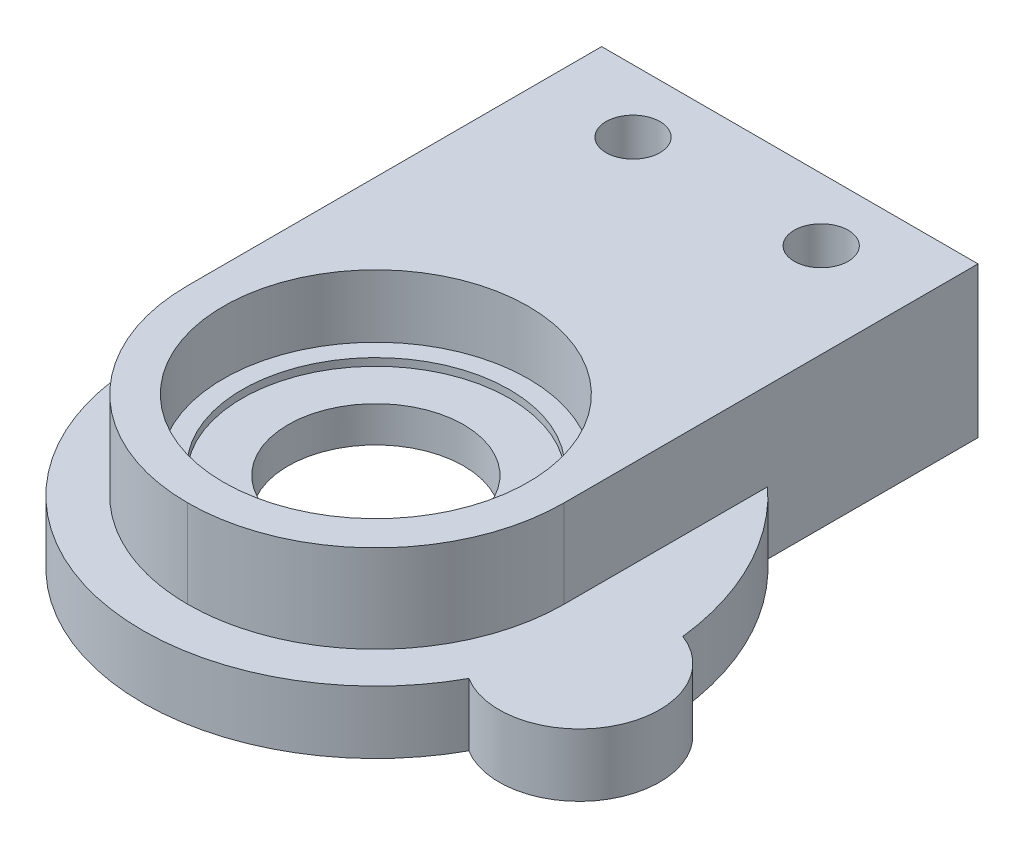
ISO-10303-21;
HEADER;
FILE_DESCRIPTION(('STEP AP214'),'2;1');
FILE_NAME('part.step','',(''),(''),'','','');
FILE_SCHEMA(('AUTOMOTIVE_DESIGN { 1 0 10303 214 1 1 1 1 }'));
ENDSEC;
DATA;
#1=APPLICATION_CONTEXT('core data for automotive mechanical design processes');
#2=APPLICATION_PROTOCOL_DEFINITION('international standard','automotive_design',2000,#1);
#3=PRODUCT_CONTEXT('',#1,'mechanical');
#4=PRODUCT('Part','Part','',(#3));
#5=PRODUCT_RELATED_PRODUCT_CATEGORY('part','',(#4));
#6=PRODUCT_DEFINITION_FORMATION('','',#4);
#7=PRODUCT_DEFINITION_CONTEXT('part definition',#1,'design');
#8=PRODUCT_DEFINITION('design','',#6,#7);
#9=PRODUCT_DEFINITION_SHAPE('','',#8);
#10=(LENGTH_UNIT() NAMED_UNIT(*) SI_UNIT(.MILLI.,.METRE.));
#11=(NAMED_UNIT(*) PLANE_ANGLE_UNIT() SI_UNIT($,.RADIAN.));
#12=(NAMED_UNIT(*) SI_UNIT($,.STERADIAN.) SOLID_ANGLE_UNIT());
#13=UNCERTAINTY_MEASURE_WITH_UNIT(LENGTH_MEASURE(1.E-05),#10,'distance_accuracy_value','');
#14=(GEOMETRIC_REPRESENTATION_CONTEXT(3) GLOBAL_UNCERTAINTY_ASSIGNED_CONTEXT((#13)) GLOBAL_UNIT_ASSIGNED_CONTEXT((#10,
#11,#12)) REPRESENTATION_CONTEXT('',''));
#15=CARTESIAN_POINT('',(0.,0.,0.));
#16=DIRECTION('',(0.,0.,1.));
#17=DIRECTION('',(1.,0.,0.));
#18=AXIS2_PLACEMENT_3D('',#15,#16,#17);
#19=CARTESIAN_POINT('',(15.,-1.,0.));
#20=DIRECTION('',(1.,0.,0.));
#21=DIRECTION('',(0.,0.,-1.));
#22=AXIS2_PLACEMENT_3D('',#19,#20,#21);
#23=PLANE('',#22);
#24=DIRECTION('',(0.,-1.,0.));
#25=VECTOR('',#24,1.);
#26=CARTESIAN_POINT('',(15.,-2.45,28.1976568219254));
#27=LINE('',#26,#25);
#28=CARTESIAN_POINT('',(15.,-2.45,28.1976568219254));
#29=VERTEX_POINT('',#28);
#30=CARTESIAN_POINT('',(15.,-6.,28.1976568219254));
#31=VERTEX_POINT('',#30);
#32=EDGE_CURVE('E68',#29,#31,#27,.T.);
#33=ORIENTED_EDGE('',*,*,#32,.F.);
#34=DIRECTION('',(0.,0.,-1.));
#35=VECTOR('',#34,1.);
#36=CARTESIAN_POINT('',(15.,-2.45,0.));
#37=LINE('',#36,#35);
#38=CARTESIAN_POINT('',(15.,-2.45,33.));
#39=VERTEX_POINT('',#38);
#40=EDGE_CURVE('E151',#39,#29,#37,.T.);
#41=ORIENTED_EDGE('',*,*,#40,.F.);
#42=DIRECTION('',(0.,-1.,0.));
#43=VECTOR('',#42,1.);
#44=CARTESIAN_POINT('',(15.,-1.,33.));
#45=LINE('',#44,#43);
#46=CARTESIAN_POINT('',(15.,-1.,33.));
#47=VERTEX_POINT('',#46);
#48=EDGE_CURVE('E133',#47,#39,#45,.T.);
#49=ORIENTED_EDGE('',*,*,#48,.F.);
#50=DIRECTION('',(0.,0.,1.));
#51=VECTOR('',#50,1.);
#52=CARTESIAN_POINT('',(15.,-1.,0.));
#53=LINE('',#52,#51);
#54=CARTESIAN_POINT('',(15.,-1.,16.7700893409728));
#55=VERTEX_POINT('',#54);
#56=EDGE_CURVE('E77',#55,#47,#53,.T.);
#57=ORIENTED_EDGE('',*,*,#56,.F.);
#58=DIRECTION('',(0.,-1.,0.));
#59=VECTOR('',#58,1.);
#60=CARTESIAN_POINT('',(15.,-1.,16.7700893409728));
#61=LINE('',#60,#59);
#62=CARTESIAN_POINT('',(15.,-6.,16.7700893409728));
#63=VERTEX_POINT('',#62);
#64=EDGE_CURVE('E61',#55,#63,#61,.T.);
#65=ORIENTED_EDGE('',*,*,#64,.T.);
#66=DIRECTION('',(0.,0.,1.));
#67=VECTOR('',#66,1.);
#68=CARTESIAN_POINT('',(15.,-6.,0.));
#69=LINE('',#68,#67);
#70=EDGE_CURVE('E98',#63,#31,#69,.T.);
#71=ORIENTED_EDGE('',*,*,#70,.T.);
#72=EDGE_LOOP('',(#33,#41,#49,#57,#65,#71));
#73=FACE_BOUND('',#72,.T.);
#74=ADVANCED_FACE('F53',(#73),#23,.F.);
#75=CARTESIAN_POINT('',(0.,-1.,33.));
#76=DIRECTION('',(0.,-1.,0.));
#77=DIRECTION('',(0.,0.,-1.));
#78=AXIS2_PLACEMENT_3D('',#75,#76,#77);
#79=CYLINDRICAL_SURFACE('',#78,15.);
#80=CARTESIAN_POINT('',(0.,-2.45,33.));
#81=DIRECTION('',(0.,-1.,0.));
#82=DIRECTION('',(0.,0.,-1.));
#83=AXIS2_PLACEMENT_3D('',#80,#81,#82);
#84=CIRCLE('',#83,15.);
#85=CARTESIAN_POINT('',(-15.,-2.45,33.));
#86=VERTEX_POINT('',#85);
#87=EDGE_CURVE('E130',#86,#39,#84,.F.);
#88=ORIENTED_EDGE('',*,*,#87,.F.);
#89=DIRECTION('',(0.,-1.,0.));
#90=VECTOR('',#89,1.);
#91=CARTESIAN_POINT('',(-15.,-1.,33.));
#92=LINE('',#91,#90);
#93=CARTESIAN_POINT('',(-15.,-1.,33.));
#94=VERTEX_POINT('',#93);
#95=EDGE_CURVE('E126',#94,#86,#92,.T.);
#96=ORIENTED_EDGE('',*,*,#95,.F.);
#97=CARTESIAN_POINT('',(0.,-1.,33.));
#98=DIRECTION('',(0.,-1.,0.));
#99=DIRECTION('',(0.,0.,-1.));
#100=AXIS2_PLACEMENT_3D('',#97,#98,#99);
#101=CIRCLE('',#100,15.);
#102=EDGE_CURVE('E115',#47,#94,#101,.T.);
#103=ORIENTED_EDGE('',*,*,#102,.F.);
#104=ORIENTED_EDGE('',*,*,#48,.T.);
#105=EDGE_LOOP('',(#88,#96,#103,#104));
#106=FACE_BOUND('',#105,.T.);
#107=ADVANCED_FACE('F127',(#106),#79,.F.);
#108=CARTESIAN_POINT('',(-15.,-1.,0.));
#109=DIRECTION('',(-1.,0.,0.));
#110=DIRECTION('',(0.,0.,1.));
#111=AXIS2_PLACEMENT_3D('',#108,#109,#110);
#112=PLANE('',#111);
#113=DIRECTION('',(0.,-1.,0.));
#114=VECTOR('',#113,1.);
#115=CARTESIAN_POINT('',(-15.,-2.45,28.1976568219254));
#116=LINE('',#115,#114);
#117=CARTESIAN_POINT('',(-15.,-6.,28.1976568219254));
#118=VERTEX_POINT('',#117);
#119=CARTESIAN_POINT('',(-15.,-2.45,28.1976568219254));
#120=VERTEX_POINT('',#119);
#121=EDGE_CURVE('E290',#118,#120,#116,.F.);
#122=ORIENTED_EDGE('',*,*,#121,.F.);
#123=DIRECTION('',(0.,0.,-1.));
#124=VECTOR('',#123,1.);
#125=CARTESIAN_POINT('',(-15.,-6.,0.));
#126=LINE('',#125,#124);
#127=CARTESIAN_POINT('',(-15.,-6.,22.001818332106));
#128=VERTEX_POINT('',#127);
#129=EDGE_CURVE('E155',#118,#128,#126,.T.);
#130=ORIENTED_EDGE('',*,*,#129,.T.);
#131=DIRECTION('',(0.,-1.,0.));
#132=VECTOR('',#131,1.);
#133=CARTESIAN_POINT('',(-15.,-1.,22.001818332106));
#134=LINE('',#133,#132);
#135=CARTESIAN_POINT('',(-15.,-1.,22.001818332106));
#136=VERTEX_POINT('',#135);
#137=EDGE_CURVE('E134',#136,#128,#134,.T.);
#138=ORIENTED_EDGE('',*,*,#137,.F.);
#139=DIRECTION('',(0.,0.,-1.));
#140=VECTOR('',#139,1.);
#141=CARTESIAN_POINT('',(-15.,-1.,0.));
#142=LINE('',#141,#140);
#143=EDGE_CURVE('E119',#94,#136,#142,.T.);
#144=ORIENTED_EDGE('',*,*,#143,.F.);
#145=ORIENTED_EDGE('',*,*,#95,.T.);
#146=DIRECTION('',(0.,0.,1.));
#147=VECTOR('',#146,1.);
#148=CARTESIAN_POINT('',(-15.,-2.45,0.));
#149=LINE('',#148,#147);
#150=EDGE_CURVE('E13',#120,#86,#149,.T.);
#151=ORIENTED_EDGE('',*,*,#150,.F.);
#152=EDGE_LOOP('',(#122,#130,#138,#144,#145,#151));
#153=FACE_BOUND('',#152,.T.);
#154=ADVANCED_FACE('F137',(#153),#112,.F.);
#155=CARTESIAN_POINT('',(0.,-1.,33.));
#156=DIRECTION('',(0.,-1.,0.));
#157=DIRECTION('',(0.,0.,-1.));
#158=AXIS2_PLACEMENT_3D('',#155,#156,#157);
#159=CYLINDRICAL_SURFACE('',#158,22.1000000000001);
#160=CARTESIAN_POINT('',(0.,-6.,33.));
#161=DIRECTION('',(0.,-1.,0.));
#162=DIRECTION('',(0.,0.,-1.));
#163=AXIS2_PLACEMENT_3D('',#160,#161,#162);
#164=CIRCLE('',#163,22.1000000000001);
#165=CARTESIAN_POINT('',(21.9564744549558,-6.,30.4853967492111));
#166=VERTEX_POINT('',#165);
#167=EDGE_CURVE('E147',#166,#63,#164,.F.);
#168=ORIENTED_EDGE('',*,*,#167,.T.);
#169=ORIENTED_EDGE('',*,*,#64,.F.);
#170=CARTESIAN_POINT('',(0.,-1.,33.));
#171=DIRECTION('',(0.,-1.,0.));
#172=DIRECTION('',(0.,0.,-1.));
#173=AXIS2_PLACEMENT_3D('',#170,#171,#172);
#174=CIRCLE('',#173,22.1000000000001);
#175=CARTESIAN_POINT('',(21.9564744549558,-1.,30.4853967492111));
#176=VERTEX_POINT('',#175);
#177=EDGE_CURVE('E158',#176,#55,#174,.F.);
#178=ORIENTED_EDGE('',*,*,#177,.F.);
#179=DIRECTION('',(0.,-1.,0.));
#180=VECTOR('',#179,1.);
#181=CARTESIAN_POINT('',(21.9564744549558,-1.,30.4853967492111));
#182=LINE('',#181,#180);
#183=EDGE_CURVE('E146',#176,#166,#182,.T.);
#184=ORIENTED_EDGE('',*,*,#183,.T.);
#185=EDGE_LOOP('',(#168,#169,#178,#184));
#186=FACE_BOUND('',#185,.T.);
#187=ADVANCED_FACE('F55',(#186),#159,.T.);
#188=CARTESIAN_POINT('',(0.,-1.,33.));
#189=DIRECTION('',(0.,-1.,0.));
#190=DIRECTION('',(0.,0.,-1.));
#191=AXIS2_PLACEMENT_3D('',#188,#189,#190);
#192=CYLINDRICAL_SURFACE('',#191,18.6);
#193=CARTESIAN_POINT('',(0.,-6.,33.));
#194=DIRECTION('',(0.,-1.,0.));
#195=DIRECTION('',(0.,0.,-1.));
#196=AXIS2_PLACEMENT_3D('',#193,#194,#195);
#197=CIRCLE('',#196,18.6);
#198=CARTESIAN_POINT('',(16.3252436861738,-6.,41.9132720471801));
#199=VERTEX_POINT('',#198);
#200=EDGE_CURVE('E153',#128,#199,#197,.F.);
#201=ORIENTED_EDGE('',*,*,#200,.T.);
#202=DIRECTION('',(0.,-1.,0.));
#203=VECTOR('',#202,1.);
#204=CARTESIAN_POINT('',(16.3252436861738,-1.,41.9132720471801));
#205=LINE('',#204,#203);
#206=CARTESIAN_POINT('',(16.3252436861738,-1.,41.9132720471801));
#207=VERTEX_POINT('',#206);
#208=EDGE_CURVE('E162',#207,#199,#205,.T.);
#209=ORIENTED_EDGE('',*,*,#208,.F.);
#210=CARTESIAN_POINT('',(0.,-1.,33.));
#211=DIRECTION('',(0.,-1.,0.));
#212=DIRECTION('',(0.,0.,-1.));
#213=AXIS2_PLACEMENT_3D('',#210,#211,#212);
#214=CIRCLE('',#213,18.6);
#215=EDGE_CURVE('E140',#136,#207,#214,.F.);
#216=ORIENTED_EDGE('',*,*,#215,.F.);
#217=ORIENTED_EDGE('',*,*,#137,.T.);
#218=EDGE_LOOP('',(#201,#209,#216,#217));
#219=FACE_BOUND('',#218,.T.);
#220=ADVANCED_FACE('F176',(#219),#192,.T.);
#221=CARTESIAN_POINT('',(19.6961550602442,-1.,36.4729635533386));
#222=DIRECTION('',(0.,-1.,0.));
#223=DIRECTION('',(0.,0.,-1.));
#224=AXIS2_PLACEMENT_3D('',#221,#222,#223);
#225=CYLINDRICAL_SURFACE('',#224,6.4);
#226=CARTESIAN_POINT('',(19.6961550602442,-6.,36.4729635533386));
#227=DIRECTION('',(0.,-1.,0.));
#228=DIRECTION('',(0.,0.,-1.));
#229=AXIS2_PLACEMENT_3D('',#226,#227,#228);
#230=CIRCLE('',#229,6.4);
#231=EDGE_CURVE('E150',#199,#166,#230,.F.);
#232=ORIENTED_EDGE('',*,*,#231,.T.);
#233=ORIENTED_EDGE('',*,*,#183,.F.);
#234=CARTESIAN_POINT('',(19.6961550602442,-1.,36.4729635533386));
#235=DIRECTION('',(0.,-1.,0.));
#236=DIRECTION('',(0.,0.,-1.));
#237=AXIS2_PLACEMENT_3D('',#234,#235,#236);
#238=CIRCLE('',#237,6.4);
#239=EDGE_CURVE('E105',#207,#176,#238,.F.);
#240=ORIENTED_EDGE('',*,*,#239,.F.);
#241=ORIENTED_EDGE('',*,*,#208,.T.);
#242=EDGE_LOOP('',(#232,#233,#240,#241));
#243=FACE_BOUND('',#242,.T.);
#244=ADVANCED_FACE('F173',(#243),#225,.T.);
#245=CARTESIAN_POINT('',(0.,-1.,0.));
#246=DIRECTION('',(0.,-1.,0.));
#247=DIRECTION('',(0.,0.,-1.));
#248=AXIS2_PLACEMENT_3D('',#245,#246,#247);
#249=PLANE('',#248);
#250=ORIENTED_EDGE('',*,*,#177,.T.);
#251=ORIENTED_EDGE('',*,*,#56,.T.);
#252=ORIENTED_EDGE('',*,*,#102,.T.);
#253=ORIENTED_EDGE('',*,*,#143,.T.);
#254=ORIENTED_EDGE('',*,*,#215,.T.);
#255=ORIENTED_EDGE('',*,*,#239,.T.);
#256=EDGE_LOOP('',(#250,#251,#252,#253,#254,#255));
#257=FACE_BOUND('',#256,.T.);
#258=ADVANCED_FACE('F117',(#257),#249,.F.);
#259=CARTESIAN_POINT('',(0.,-6.,0.));
#260=DIRECTION('',(0.,-1.,0.));
#261=DIRECTION('',(0.,0.,-1.));
#262=AXIS2_PLACEMENT_3D('',#259,#260,#261);
#263=PLANE('',#262);
#264=ORIENTED_EDGE('',*,*,#129,.F.);
#265=CARTESIAN_POINT('',(0.,-6.,33.));
#266=DIRECTION('',(0.,-1.,0.));
#267=DIRECTION('',(0.,0.,-1.));
#268=AXIS2_PLACEMENT_3D('',#265,#266,#267);
#269=CIRCLE('',#268,15.75);
#270=EDGE_CURVE('E291',#118,#31,#269,.F.);
#271=ORIENTED_EDGE('',*,*,#270,.T.);
#272=ORIENTED_EDGE('',*,*,#70,.F.);
#273=ORIENTED_EDGE('',*,*,#167,.F.);
#274=ORIENTED_EDGE('',*,*,#231,.F.);
#275=ORIENTED_EDGE('',*,*,#200,.F.);
#276=EDGE_LOOP('',(#264,#271,#272,#273,#274,#275));
#277=FACE_BOUND('',#276,.T.);
#278=ADVANCED_FACE('F171',(#277),#263,.T.);
#279=CARTESIAN_POINT('',(0.,-2.45,0.));
#280=DIRECTION('',(0.,-1.,0.));
#281=DIRECTION('',(0.,0.,-1.));
#282=AXIS2_PLACEMENT_3D('',#279,#280,#281);
#283=PLANE('',#282);
#284=ORIENTED_EDGE('',*,*,#40,.T.);
#285=CARTESIAN_POINT('',(0.,-2.45,33.));
#286=DIRECTION('',(0.,-1.,0.));
#287=DIRECTION('',(0.,0.,-1.));
#288=AXIS2_PLACEMENT_3D('',#285,#286,#287);
#289=CIRCLE('',#288,15.75);
#290=EDGE_CURVE('E285',#120,#29,#289,.F.);
#291=ORIENTED_EDGE('',*,*,#290,.F.);
#292=ORIENTED_EDGE('',*,*,#150,.T.);
#293=ORIENTED_EDGE('',*,*,#87,.T.);
#294=EDGE_LOOP('',(#284,#291,#292,#293));
#295=FACE_BOUND('',#294,.T.);
#296=ADVANCED_FACE('F251',(#295),#283,.T.);
#297=CARTESIAN_POINT('',(0.,-2.45,33.));
#298=DIRECTION('',(0.,-1.,0.));
#299=DIRECTION('',(0.,0.,-1.));
#300=AXIS2_PLACEMENT_3D('',#297,#298,#299);
#301=CYLINDRICAL_SURFACE('',#300,15.75);
#302=ORIENTED_EDGE('',*,*,#32,.T.);
#303=ORIENTED_EDGE('',*,*,#270,.F.);
#304=ORIENTED_EDGE('',*,*,#121,.T.);
#305=ORIENTED_EDGE('',*,*,#290,.T.);
#306=EDGE_LOOP('',(#302,#303,#304,#305));
#307=FACE_BOUND('',#306,.T.);
#308=ADVANCED_FACE('F262',(#307),#301,.F.);
#309=CLOSED_SHELL('',(#74,#107,#154,#187,#220,#244,#258,#278,#296,#308));
#310=MANIFOLD_SOLID_BREP('B2',#309);
#311=CARTESIAN_POINT('',(0.,-6.,48.));
#312=DIRECTION('',(0.,1.,0.));
#313=DIRECTION('',(0.,0.,1.));
#314=AXIS2_PLACEMENT_3D('',#311,#312,#313);
#315=PLANE('',#314);
#316=CARTESIAN_POINT('',(0.,-6.,33.));
#317=DIRECTION('',(0.,-1.,0.));
#318=DIRECTION('',(0.,0.,-1.));
#319=AXIS2_PLACEMENT_3D('',#316,#317,#318);
#320=CIRCLE('',#319,15.75);
#321=CARTESIAN_POINT('',(15.,-6.,28.1976568219254));
#322=VERTEX_POINT('',#321);
#323=CARTESIAN_POINT('',(-15.,-6.,28.1976568219254));
#324=VERTEX_POINT('',#323);
#325=EDGE_CURVE('E388',#322,#324,#320,.F.);
#326=ORIENTED_EDGE('',*,*,#325,.T.);
#327=DIRECTION('',(0.,0.,-1.));
#328=VECTOR('',#327,1.);
#329=CARTESIAN_POINT('',(-15.,-6.,48.));
#330=LINE('',#329,#328);
#331=CARTESIAN_POINT('',(-15.,-6.,0.));
#332=VERTEX_POINT('',#331);
#333=EDGE_CURVE('E402',#324,#332,#330,.T.);
#334=ORIENTED_EDGE('',*,*,#333,.T.);
#335=DIRECTION('',(1.,0.,0.));
#336=VECTOR('',#335,1.);
#337=CARTESIAN_POINT('',(0.,-6.,0.));
#338=LINE('',#337,#336);
#339=CARTESIAN_POINT('',(15.,-6.,0.));
#340=VERTEX_POINT('',#339);
#341=EDGE_CURVE('E415',#332,#340,#338,.T.);
#342=ORIENTED_EDGE('',*,*,#341,.T.);
#343=DIRECTION('',(0.,0.,-1.));
#344=VECTOR('',#343,1.);
#345=CARTESIAN_POINT('',(15.,-6.,48.));
#346=LINE('',#345,#344);
#347=EDGE_CURVE('E404',#322,#340,#346,.T.);
#348=ORIENTED_EDGE('',*,*,#347,.F.);
#349=EDGE_LOOP('',(#326,#334,#342,#348));
#350=FACE_BOUND('',#349,.T.);
#351=CARTESIAN_POINT('',(7.5,-6.,5.));
#352=DIRECTION('',(0.,-1.,0.));
#353=DIRECTION('',(0.,0.,-1.));
#354=AXIS2_PLACEMENT_3D('',#351,#352,#353);
#355=CIRCLE('',#354,3.65);
#356=CARTESIAN_POINT('',(7.5,-6.,1.35));
#357=VERTEX_POINT('',#356);
#358=EDGE_CURVE('E558',#357,#357,#355,.T.);
#359=ORIENTED_EDGE('',*,*,#358,.F.);
#360=EDGE_LOOP('',(#359));
#361=FACE_BOUND('',#360,.T.);
#362=CARTESIAN_POINT('',(-7.5,-6.,5.));
#363=DIRECTION('',(0.,-1.,0.));
#364=DIRECTION('',(0.,0.,-1.));
#365=AXIS2_PLACEMENT_3D('',#362,#363,#364);
#366=CIRCLE('',#365,3.65);
#367=CARTESIAN_POINT('',(-7.5,-6.,1.35));
#368=VERTEX_POINT('',#367);
#369=EDGE_CURVE('E549',#368,#368,#366,.F.);
#370=ORIENTED_EDGE('',*,*,#369,.T.);
#371=EDGE_LOOP('',(#370));
#372=FACE_BOUND('',#371,.T.);
#373=ADVANCED_FACE('F326',(#350,#361,#372),#315,.F.);
#374=CARTESIAN_POINT('',(7.5,6.001,5.));
#375=DIRECTION('',(0.,-1.,0.));
#376=DIRECTION('',(0.,0.,-1.));
#377=AXIS2_PLACEMENT_3D('',#374,#375,#376);
#378=CYLINDRICAL_SURFACE('',#377,2.15);
#379=CARTESIAN_POINT('',(7.5,6.,5.));
#380=DIRECTION('',(0.,1.,0.));
#381=DIRECTION('',(0.,0.,1.));
#382=AXIS2_PLACEMENT_3D('',#379,#380,#381);
#383=CIRCLE('',#382,2.15);
#384=CARTESIAN_POINT('',(7.5,6.,7.15));
#385=VERTEX_POINT('',#384);
#386=EDGE_CURVE('E572',#385,#385,#383,.F.);
#387=ORIENTED_EDGE('',*,*,#386,.F.);
#388=EDGE_LOOP('',(#387));
#389=FACE_BOUND('',#388,.T.);
#390=CARTESIAN_POINT('',(7.5,-1.,5.));
#391=DIRECTION('',(0.,-1.,0.));
#392=DIRECTION('',(0.,0.,-1.));
#393=AXIS2_PLACEMENT_3D('',#390,#391,#392);
#394=CIRCLE('',#393,2.15);
#395=CARTESIAN_POINT('',(7.5,-1.,2.85));
#396=VERTEX_POINT('',#395);
#397=EDGE_CURVE('E555',#396,#396,#394,.T.);
#398=ORIENTED_EDGE('',*,*,#397,.T.);
#399=EDGE_LOOP('',(#398));
#400=FACE_BOUND('',#399,.T.);
#401=ADVANCED_FACE('F473',(#389,#400),#378,.F.);
#402=CARTESIAN_POINT('',(-7.5,6.001,5.));
#403=DIRECTION('',(0.,-1.,0.));
#404=DIRECTION('',(0.,0.,-1.));
#405=AXIS2_PLACEMENT_3D('',#402,#403,#404);
#406=CYLINDRICAL_SURFACE('',#405,2.15);
#407=CARTESIAN_POINT('',(-7.5,6.,5.));
#408=DIRECTION('',(0.,1.,0.));
#409=DIRECTION('',(0.,0.,1.));
#410=AXIS2_PLACEMENT_3D('',#407,#408,#409);
#411=CIRCLE('',#410,2.15);
#412=CARTESIAN_POINT('',(-7.5,6.,7.15));
#413=VERTEX_POINT('',#412);
#414=EDGE_CURVE('E577',#413,#413,#411,.T.);
#415=ORIENTED_EDGE('',*,*,#414,.T.);
#416=EDGE_LOOP('',(#415));
#417=FACE_BOUND('',#416,.T.);
#418=CARTESIAN_POINT('',(-7.5,-1.,5.));
#419=DIRECTION('',(0.,-1.,0.));
#420=DIRECTION('',(0.,0.,-1.));
#421=AXIS2_PLACEMENT_3D('',#418,#419,#420);
#422=CIRCLE('',#421,2.15);
#423=CARTESIAN_POINT('',(-7.5,-1.,2.85));
#424=VERTEX_POINT('',#423);
#425=EDGE_CURVE('E540',#424,#424,#422,.F.);
#426=ORIENTED_EDGE('',*,*,#425,.F.);
#427=EDGE_LOOP('',(#426));
#428=FACE_BOUND('',#427,.T.);
#429=ADVANCED_FACE('F466',(#417,#428),#406,.F.);
#430=CARTESIAN_POINT('',(0.,6.001,33.));
#431=DIRECTION('',(0.,-1.,0.));
#432=DIRECTION('',(0.,0.,-1.));
#433=AXIS2_PLACEMENT_3D('',#430,#431,#432);
#434=CYLINDRICAL_SURFACE('',#433,7.);
#435=CARTESIAN_POINT('',(0.,-2.45,33.));
#436=DIRECTION('',(0.,-1.,0.));
#437=DIRECTION('',(0.,0.,-1.));
#438=AXIS2_PLACEMENT_3D('',#435,#436,#437);
#439=CIRCLE('',#438,7.);
#440=CARTESIAN_POINT('',(0.,-2.45,26.));
#441=VERTEX_POINT('',#440);
#442=EDGE_CURVE('E405',#441,#441,#439,.T.);
#443=ORIENTED_EDGE('',*,*,#442,.T.);
#444=EDGE_LOOP('',(#443));
#445=FACE_BOUND('',#444,.T.);
#446=CARTESIAN_POINT('',(0.,0.4,33.));
#447=DIRECTION('',(0.,1.,0.));
#448=DIRECTION('',(0.,0.,1.));
#449=AXIS2_PLACEMENT_3D('',#446,#447,#448);
#450=CIRCLE('',#449,7.);
#451=CARTESIAN_POINT('',(0.,0.4,40.));
#452=VERTEX_POINT('',#451);
#453=EDGE_CURVE('E544',#452,#452,#450,.F.);
#454=ORIENTED_EDGE('',*,*,#453,.F.);
#455=EDGE_LOOP('',(#454));
#456=FACE_BOUND('',#455,.T.);
#457=ADVANCED_FACE('F458',(#445,#456),#434,.F.);
#458=CARTESIAN_POINT('',(0.,6.,48.));
#459=DIRECTION('',(0.,1.,0.));
#460=DIRECTION('',(0.,0.,1.));
#461=AXIS2_PLACEMENT_3D('',#458,#459,#460);
#462=PLANE('',#461);
#463=CARTESIAN_POINT('',(0.,6.,33.));
#464=DIRECTION('',(0.,1.,0.));
#465=DIRECTION('',(0.,0.,1.));
#466=AXIS2_PLACEMENT_3D('',#463,#464,#465);
#467=CIRCLE('',#466,12.15);
#468=CARTESIAN_POINT('',(0.,6.,45.15));
#469=VERTEX_POINT('',#468);
#470=EDGE_CURVE('E568',#469,#469,#467,.T.);
#471=ORIENTED_EDGE('',*,*,#470,.F.);
#472=EDGE_LOOP('',(#471));
#473=FACE_BOUND('',#472,.T.);
#474=ORIENTED_EDGE('',*,*,#414,.F.);
#475=EDGE_LOOP('',(#474));
#476=FACE_BOUND('',#475,.T.);
#477=ORIENTED_EDGE('',*,*,#386,.T.);
#478=EDGE_LOOP('',(#477));
#479=FACE_BOUND('',#478,.T.);
#480=DIRECTION('',(0.,0.,-1.));
#481=VECTOR('',#480,1.);
#482=CARTESIAN_POINT('',(-15.,6.,48.));
#483=LINE('',#482,#481);
#484=CARTESIAN_POINT('',(-15.,6.,33.));
#485=VERTEX_POINT('',#484);
#486=CARTESIAN_POINT('',(-15.,6.,0.));
#487=VERTEX_POINT('',#486);
#488=EDGE_CURVE('E411',#485,#487,#483,.T.);
#489=ORIENTED_EDGE('',*,*,#488,.F.);
#490=CARTESIAN_POINT('',(0.,6.,33.));
#491=DIRECTION('',(0.,1.,0.));
#492=DIRECTION('',(0.,0.,1.));
#493=AXIS2_PLACEMENT_3D('',#490,#491,#492);
#494=CIRCLE('',#493,15.);
#495=CARTESIAN_POINT('',(0.,6.,48.));
#496=VERTEX_POINT('',#495);
#497=EDGE_CURVE('E423',#485,#496,#494,.T.);
#498=ORIENTED_EDGE('',*,*,#497,.T.);
#499=CARTESIAN_POINT('',(0.,6.,33.));
#500=DIRECTION('',(0.,1.,0.));
#501=DIRECTION('',(0.,0.,1.));
#502=AXIS2_PLACEMENT_3D('',#499,#500,#501);
#503=CIRCLE('',#502,15.);
#504=CARTESIAN_POINT('',(15.,6.,33.));
#505=VERTEX_POINT('',#504);
#506=EDGE_CURVE('E348',#496,#505,#503,.T.);
#507=ORIENTED_EDGE('',*,*,#506,.T.);
#508=DIRECTION('',(0.,0.,-1.));
#509=VECTOR('',#508,1.);
#510=CARTESIAN_POINT('',(15.,6.,48.));
#511=LINE('',#510,#509);
#512=CARTESIAN_POINT('',(15.,6.,0.));
#513=VERTEX_POINT('',#512);
#514=EDGE_CURVE('E413',#505,#513,#511,.T.);
#515=ORIENTED_EDGE('',*,*,#514,.T.);
#516=DIRECTION('',(1.,0.,0.));
#517=VECTOR('',#516,1.);
#518=CARTESIAN_POINT('',(0.,6.,0.));
#519=LINE('',#518,#517);
#520=EDGE_CURVE('E432',#487,#513,#519,.T.);
#521=ORIENTED_EDGE('',*,*,#520,.F.);
#522=EDGE_LOOP('',(#489,#498,#507,#515,#521));
#523=FACE_BOUND('',#522,.T.);
#524=ADVANCED_FACE('F456',(#473,#476,#479,#523),#462,.T.);
#525=CARTESIAN_POINT('',(15.,0.,48.));
#526=DIRECTION('',(1.,0.,0.));
#527=DIRECTION('',(0.,0.,-1.));
#528=AXIS2_PLACEMENT_3D('',#525,#526,#527);
#529=PLANE('',#528);
#530=DIRECTION('',(0.,0.,-1.));
#531=VECTOR('',#530,1.);
#532=CARTESIAN_POINT('',(15.,-2.45,48.));
#533=LINE('',#532,#531);
#534=CARTESIAN_POINT('',(15.,-2.45,33.));
#535=VERTEX_POINT('',#534);
#536=CARTESIAN_POINT('',(15.,-2.45,28.1976568219254));
#537=VERTEX_POINT('',#536);
#538=EDGE_CURVE('E396',#535,#537,#533,.T.);
#539=ORIENTED_EDGE('',*,*,#538,.T.);
#540=DIRECTION('',(0.,-1.,0.));
#541=VECTOR('',#540,1.);
#542=CARTESIAN_POINT('',(15.,-2.45,28.1976568219254));
#543=LINE('',#542,#541);
#544=EDGE_CURVE('E395',#537,#322,#543,.T.);
#545=ORIENTED_EDGE('',*,*,#544,.T.);
#546=ORIENTED_EDGE('',*,*,#347,.T.);
#547=DIRECTION('',(0.,-1.,0.));
#548=VECTOR('',#547,1.);
#549=CARTESIAN_POINT('',(15.,0.,0.));
#550=LINE('',#549,#548);
#551=EDGE_CURVE('E427',#513,#340,#550,.T.);
#552=ORIENTED_EDGE('',*,*,#551,.F.);
#553=ORIENTED_EDGE('',*,*,#514,.F.);
#554=DIRECTION('',(0.,-1.,0.));
#555=VECTOR('',#554,1.);
#556=CARTESIAN_POINT('',(15.,0.,33.));
#557=LINE('',#556,#555);
#558=EDGE_CURVE('E334',#505,#535,#557,.T.);
#559=ORIENTED_EDGE('',*,*,#558,.T.);
#560=EDGE_LOOP('',(#539,#545,#546,#552,#553,#559));
#561=FACE_BOUND('',#560,.T.);
#562=ADVANCED_FACE('F445',(#561),#529,.T.);
#563=CARTESIAN_POINT('',(-15.,0.,48.));
#564=DIRECTION('',(1.,0.,0.));
#565=DIRECTION('',(0.,1.,0.));
#566=AXIS2_PLACEMENT_3D('',#563,#564,#565);
#567=PLANE('',#566);
#568=DIRECTION('',(0.,-1.,0.));
#569=VECTOR('',#568,1.);
#570=CARTESIAN_POINT('',(-15.,-2.45,28.1976568219254));
#571=LINE('',#570,#569);
#572=CARTESIAN_POINT('',(-15.,-2.45,28.1976568219254));
#573=VERTEX_POINT('',#572);
#574=EDGE_CURVE('E385',#573,#324,#571,.T.);
#575=ORIENTED_EDGE('',*,*,#574,.F.);
#576=DIRECTION('',(0.,0.,-1.));
#577=VECTOR('',#576,1.);
#578=CARTESIAN_POINT('',(-15.,-2.45,48.));
#579=LINE('',#578,#577);
#580=CARTESIAN_POINT('',(-15.,-2.45,33.));
#581=VERTEX_POINT('',#580);
#582=EDGE_CURVE('E448',#581,#573,#579,.T.);
#583=ORIENTED_EDGE('',*,*,#582,.F.);
#584=DIRECTION('',(0.,-1.,0.));
#585=VECTOR('',#584,1.);
#586=CARTESIAN_POINT('',(-15.,6.,33.));
#587=LINE('',#586,#585);
#588=EDGE_CURVE('E420',#581,#485,#587,.F.);
#589=ORIENTED_EDGE('',*,*,#588,.T.);
#590=ORIENTED_EDGE('',*,*,#488,.T.);
#591=DIRECTION('',(0.,-1.,0.));
#592=VECTOR('',#591,1.);
#593=CARTESIAN_POINT('',(-15.,0.,0.));
#594=LINE('',#593,#592);
#595=EDGE_CURVE('E409',#487,#332,#594,.T.);
#596=ORIENTED_EDGE('',*,*,#595,.T.);
#597=ORIENTED_EDGE('',*,*,#333,.F.);
#598=EDGE_LOOP('',(#575,#583,#589,#590,#596,#597));
#599=FACE_BOUND('',#598,.T.);
#600=ADVANCED_FACE('F407',(#599),#567,.F.);
#601=CARTESIAN_POINT('',(0.,0.,33.));
#602=DIRECTION('',(0.,-1.,0.));
#603=DIRECTION('',(0.,0.,-1.));
#604=AXIS2_PLACEMENT_3D('',#601,#602,#603);
#605=CYLINDRICAL_SURFACE('',#604,15.);
#606=DIRECTION('',(0.,-1.,0.));
#607=VECTOR('',#606,1.);
#608=CARTESIAN_POINT('',(0.,0.,48.));
#609=LINE('',#608,#607);
#610=CARTESIAN_POINT('',(0.,-2.45,48.));
#611=VERTEX_POINT('',#610);
#612=EDGE_CURVE('E426',#611,#496,#609,.F.);
#613=ORIENTED_EDGE('',*,*,#612,.F.);
#614=CARTESIAN_POINT('',(0.,-2.45,33.));
#615=DIRECTION('',(0.,-1.,0.));
#616=DIRECTION('',(0.,0.,-1.));
#617=AXIS2_PLACEMENT_3D('',#614,#615,#616);
#618=CIRCLE('',#617,15.);
#619=EDGE_CURVE('E341',#611,#535,#618,.F.);
#620=ORIENTED_EDGE('',*,*,#619,.T.);
#621=ORIENTED_EDGE('',*,*,#558,.F.);
#622=ORIENTED_EDGE('',*,*,#506,.F.);
#623=EDGE_LOOP('',(#613,#620,#621,#622));
#624=FACE_BOUND('',#623,.T.);
#625=ADVANCED_FACE('F328',(#624),#605,.T.);
#626=CARTESIAN_POINT('',(0.,0.,33.));
#627=DIRECTION('',(0.,1.,0.));
#628=DIRECTION('',(-1.,0.,0.));
#629=AXIS2_PLACEMENT_3D('',#626,#627,#628);
#630=CYLINDRICAL_SURFACE('',#629,15.);
#631=ORIENTED_EDGE('',*,*,#588,.F.);
#632=CARTESIAN_POINT('',(0.,-2.45,33.));
#633=DIRECTION('',(0.,-1.,0.));
#634=DIRECTION('',(0.,0.,-1.));
#635=AXIS2_PLACEMENT_3D('',#632,#633,#634);
#636=CIRCLE('',#635,15.);
#637=EDGE_CURVE('E51',#581,#611,#636,.F.);
#638=ORIENTED_EDGE('',*,*,#637,.T.);
#639=ORIENTED_EDGE('',*,*,#612,.T.);
#640=ORIENTED_EDGE('',*,*,#497,.F.);
#641=EDGE_LOOP('',(#631,#638,#639,#640));
#642=FACE_BOUND('',#641,.T.);
#643=ADVANCED_FACE('F454',(#642),#630,.T.);
#644=CARTESIAN_POINT('',(0.,0.,0.));
#645=DIRECTION('',(0.,0.,1.));
#646=DIRECTION('',(1.,0.,0.));
#647=AXIS2_PLACEMENT_3D('',#644,#645,#646);
#648=PLANE('',#647);
#649=ORIENTED_EDGE('',*,*,#551,.T.);
#650=ORIENTED_EDGE('',*,*,#341,.F.);
#651=ORIENTED_EDGE('',*,*,#595,.F.);
#652=ORIENTED_EDGE('',*,*,#520,.T.);
#653=EDGE_LOOP('',(#649,#650,#651,#652));
#654=FACE_BOUND('',#653,.T.);
#655=ADVANCED_FACE('F443',(#654),#648,.F.);
#656=CARTESIAN_POINT('',(0.,-2.45,33.));
#657=DIRECTION('',(0.,-1.,0.));
#658=DIRECTION('',(0.,0.,-1.));
#659=AXIS2_PLACEMENT_3D('',#656,#657,#658);
#660=CYLINDRICAL_SURFACE('',#659,15.75);
#661=CARTESIAN_POINT('',(0.,-2.45,33.));
#662=DIRECTION('',(0.,-1.,0.));
#663=DIRECTION('',(0.,0.,-1.));
#664=AXIS2_PLACEMENT_3D('',#661,#662,#663);
#665=CIRCLE('',#664,15.75);
#666=EDGE_CURVE('E391',#537,#573,#665,.F.);
#667=ORIENTED_EDGE('',*,*,#666,.T.);
#668=ORIENTED_EDGE('',*,*,#574,.T.);
#669=ORIENTED_EDGE('',*,*,#325,.F.);
#670=ORIENTED_EDGE('',*,*,#544,.F.);
#671=EDGE_LOOP('',(#667,#668,#669,#670));
#672=FACE_BOUND('',#671,.T.);
#673=ADVANCED_FACE('F387',(#672),#660,.F.);
#674=CARTESIAN_POINT('',(0.,-2.45,0.));
#675=DIRECTION('',(0.,-1.,0.));
#676=DIRECTION('',(0.,0.,-1.));
#677=AXIS2_PLACEMENT_3D('',#674,#675,#676);
#678=PLANE('',#677);
#679=ORIENTED_EDGE('',*,*,#442,.F.);
#680=EDGE_LOOP('',(#679));
#681=FACE_BOUND('',#680,.T.);
#682=ORIENTED_EDGE('',*,*,#619,.F.);
#683=ORIENTED_EDGE('',*,*,#637,.F.);
#684=ORIENTED_EDGE('',*,*,#582,.T.);
#685=ORIENTED_EDGE('',*,*,#666,.F.);
#686=ORIENTED_EDGE('',*,*,#538,.F.);
#687=EDGE_LOOP('',(#682,#683,#684,#685,#686));
#688=FACE_BOUND('',#687,.T.);
#689=ADVANCED_FACE('F452',(#681,#688),#678,.T.);
#690=CARTESIAN_POINT('',(0.,1.,33.));
#691=DIRECTION('',(0.,1.,0.));
#692=DIRECTION('',(0.,0.,1.));
#693=AXIS2_PLACEMENT_3D('',#690,#691,#692);
#694=CYLINDRICAL_SURFACE('',#693,12.15);
#695=CARTESIAN_POINT('',(0.,1.,33.));
#696=DIRECTION('',(0.,1.,0.));
#697=DIRECTION('',(0.,0.,1.));
#698=AXIS2_PLACEMENT_3D('',#695,#696,#697);
#699=CIRCLE('',#698,12.15);
#700=CARTESIAN_POINT('',(0.,1.,45.15));
#701=VERTEX_POINT('',#700);
#702=EDGE_CURVE('E569',#701,#701,#699,.T.);
#703=ORIENTED_EDGE('',*,*,#702,.F.);
#704=EDGE_LOOP('',(#703));
#705=FACE_BOUND('',#704,.T.);
#706=ORIENTED_EDGE('',*,*,#470,.T.);
#707=EDGE_LOOP('',(#706));
#708=FACE_BOUND('',#707,.T.);
#709=ADVANCED_FACE('F498',(#705,#708),#694,.F.);
#710=CARTESIAN_POINT('',(0.,1.,0.));
#711=DIRECTION('',(0.,1.,0.));
#712=DIRECTION('',(0.,0.,1.));
#713=AXIS2_PLACEMENT_3D('',#710,#711,#712);
#714=PLANE('',#713);
#715=CARTESIAN_POINT('',(0.,1.,33.));
#716=DIRECTION('',(0.,1.,0.));
#717=DIRECTION('',(0.,0.,1.));
#718=AXIS2_PLACEMENT_3D('',#715,#716,#717);
#719=CIRCLE('',#718,10.65);
#720=CARTESIAN_POINT('',(0.,1.,43.65));
#721=VERTEX_POINT('',#720);
#722=EDGE_CURVE('E565',#721,#721,#719,.T.);
#723=ORIENTED_EDGE('',*,*,#722,.F.);
#724=EDGE_LOOP('',(#723));
#725=FACE_BOUND('',#724,.T.);
#726=ORIENTED_EDGE('',*,*,#702,.T.);
#727=EDGE_LOOP('',(#726));
#728=FACE_BOUND('',#727,.T.);
#729=ADVANCED_FACE('F507',(#725,#728),#714,.T.);
#730=CARTESIAN_POINT('',(0.,0.4,33.));
#731=DIRECTION('',(0.,1.,0.));
#732=DIRECTION('',(0.,0.,1.));
#733=AXIS2_PLACEMENT_3D('',#730,#731,#732);
#734=CYLINDRICAL_SURFACE('',#733,10.65);
#735=ORIENTED_EDGE('',*,*,#722,.T.);
#736=EDGE_LOOP('',(#735));
#737=FACE_BOUND('',#736,.T.);
#738=CARTESIAN_POINT('',(0.,0.4,33.));
#739=DIRECTION('',(0.,1.,0.));
#740=DIRECTION('',(0.,0.,1.));
#741=AXIS2_PLACEMENT_3D('',#738,#739,#740);
#742=CIRCLE('',#741,10.65);
#743=CARTESIAN_POINT('',(0.,0.4,43.65));
#744=VERTEX_POINT('',#743);
#745=EDGE_CURVE('E547',#744,#744,#742,.T.);
#746=ORIENTED_EDGE('',*,*,#745,.F.);
#747=EDGE_LOOP('',(#746));
#748=FACE_BOUND('',#747,.T.);
#749=ADVANCED_FACE('F511',(#737,#748),#734,.F.);
#750=CARTESIAN_POINT('',(0.,0.4,0.));
#751=DIRECTION('',(0.,1.,0.));
#752=DIRECTION('',(0.,0.,1.));
#753=AXIS2_PLACEMENT_3D('',#750,#751,#752);
#754=PLANE('',#753);
#755=ORIENTED_EDGE('',*,*,#453,.T.);
#756=EDGE_LOOP('',(#755));
#757=FACE_BOUND('',#756,.T.);
#758=ORIENTED_EDGE('',*,*,#745,.T.);
#759=EDGE_LOOP('',(#758));
#760=FACE_BOUND('',#759,.T.);
#761=ADVANCED_FACE('F515',(#757,#760),#754,.T.);
#762=CARTESIAN_POINT('',(-7.5,-1.,5.));
#763=DIRECTION('',(0.,-1.,0.));
#764=DIRECTION('',(0.,0.,-1.));
#765=AXIS2_PLACEMENT_3D('',#762,#763,#764);
#766=CYLINDRICAL_SURFACE('',#765,3.65);
#767=CARTESIAN_POINT('',(-7.5,-1.,5.));
#768=DIRECTION('',(0.,-1.,0.));
#769=DIRECTION('',(0.,0.,-1.));
#770=AXIS2_PLACEMENT_3D('',#767,#768,#769);
#771=CIRCLE('',#770,3.65);
#772=CARTESIAN_POINT('',(-7.5,-1.,1.35));
#773=VERTEX_POINT('',#772);
#774=EDGE_CURVE('E543',#773,#773,#771,.F.);
#775=ORIENTED_EDGE('',*,*,#774,.T.);
#776=EDGE_LOOP('',(#775));
#777=FACE_BOUND('',#776,.T.);
#778=ORIENTED_EDGE('',*,*,#369,.F.);
#779=EDGE_LOOP('',(#778));
#780=FACE_BOUND('',#779,.T.);
#781=ADVANCED_FACE('F519',(#777,#780),#766,.F.);
#782=CARTESIAN_POINT('',(0.,-1.,0.));
#783=DIRECTION('',(0.,-1.,0.));
#784=DIRECTION('',(0.,0.,-1.));
#785=AXIS2_PLACEMENT_3D('',#782,#783,#784);
#786=PLANE('',#785);
#787=ORIENTED_EDGE('',*,*,#425,.T.);
#788=EDGE_LOOP('',(#787));
#789=FACE_BOUND('',#788,.T.);
#790=ORIENTED_EDGE('',*,*,#774,.F.);
#791=EDGE_LOOP('',(#790));
#792=FACE_BOUND('',#791,.T.);
#793=ADVANCED_FACE('F525',(#789,#792),#786,.T.);
#794=CARTESIAN_POINT('',(7.5,-1.,5.));
#795=DIRECTION('',(0.,-1.,0.));
#796=DIRECTION('',(0.,0.,-1.));
#797=AXIS2_PLACEMENT_3D('',#794,#795,#796);
#798=CYLINDRICAL_SURFACE('',#797,3.65);
#799=CARTESIAN_POINT('',(7.5,-1.,5.));
#800=DIRECTION('',(0.,-1.,0.));
#801=DIRECTION('',(0.,0.,-1.));
#802=AXIS2_PLACEMENT_3D('',#799,#800,#801);
#803=CIRCLE('',#802,3.65);
#804=CARTESIAN_POINT('',(7.5,-1.,1.35));
#805=VERTEX_POINT('',#804);
#806=EDGE_CURVE('E554',#805,#805,#803,.T.);
#807=ORIENTED_EDGE('',*,*,#806,.F.);
#808=EDGE_LOOP('',(#807));
#809=FACE_BOUND('',#808,.T.);
#810=ORIENTED_EDGE('',*,*,#358,.T.);
#811=EDGE_LOOP('',(#810));
#812=FACE_BOUND('',#811,.T.);
#813=ADVANCED_FACE('F521',(#809,#812),#798,.F.);
#814=CARTESIAN_POINT('',(0.,-1.,0.));
#815=DIRECTION('',(0.,-1.,0.));
#816=DIRECTION('',(0.,0.,-1.));
#817=AXIS2_PLACEMENT_3D('',#814,#815,#816);
#818=PLANE('',#817);
#819=ORIENTED_EDGE('',*,*,#397,.F.);
#820=EDGE_LOOP('',(#819));
#821=FACE_BOUND('',#820,.T.);
#822=ORIENTED_EDGE('',*,*,#806,.T.);
#823=EDGE_LOOP('',(#822));
#824=FACE_BOUND('',#823,.T.);
#825=ADVANCED_FACE('F524',(#821,#824),#818,.T.);
#826=CLOSED_SHELL('',(#373,#401,#429,#457,#524,#562,#600,#625,#643,#655,#673,#689,#709,#729,
#749,#761,#781,#793,#813,#825));
#827=MANIFOLD_SOLID_BREP('B7',#826);
#828=ADVANCED_BREP_SHAPE_REPRESENTATION('',(#18,#310,#827),#14);
#829=SHAPE_DEFINITION_REPRESENTATION(#9,#828);
ENDSEC;
END-ISO-10303-21;
